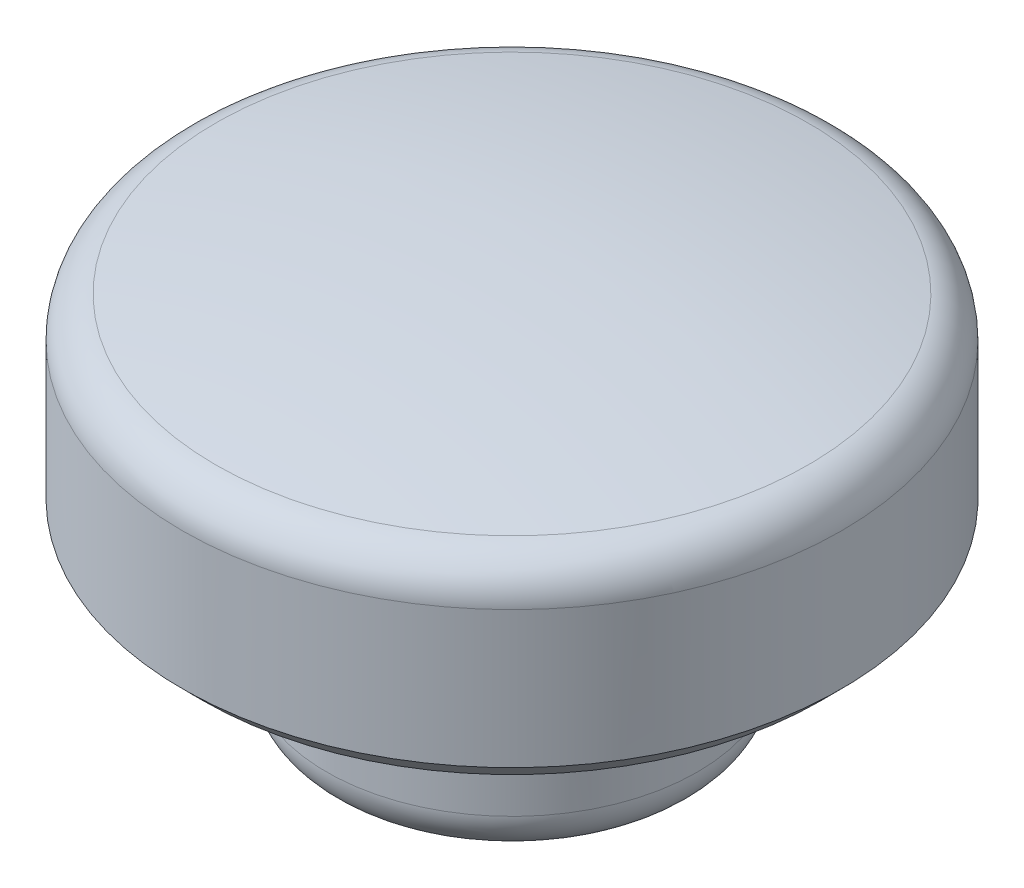
ISO-10303-21;
HEADER;
FILE_DESCRIPTION(('STEP AP214'),'2;1');
FILE_NAME('part.step','',(''),(''),'','','');
FILE_SCHEMA(('AUTOMOTIVE_DESIGN { 1 0 10303 214 1 1 1 1 }'));
ENDSEC;
DATA;
#1=APPLICATION_CONTEXT('core data for automotive mechanical design processes');
#2=APPLICATION_PROTOCOL_DEFINITION('international standard','automotive_design',2000,#1);
#3=PRODUCT_CONTEXT('',#1,'mechanical');
#4=PRODUCT('Part','Part','',(#3));
#5=PRODUCT_RELATED_PRODUCT_CATEGORY('part','',(#4));
#6=PRODUCT_DEFINITION_FORMATION('','',#4);
#7=PRODUCT_DEFINITION_CONTEXT('part definition',#1,'design');
#8=PRODUCT_DEFINITION('design','',#6,#7);
#9=PRODUCT_DEFINITION_SHAPE('','',#8);
#10=(LENGTH_UNIT() NAMED_UNIT(*) SI_UNIT(.MILLI.,.METRE.));
#11=(NAMED_UNIT(*) PLANE_ANGLE_UNIT() SI_UNIT($,.RADIAN.));
#12=(NAMED_UNIT(*) SI_UNIT($,.STERADIAN.) SOLID_ANGLE_UNIT());
#13=UNCERTAINTY_MEASURE_WITH_UNIT(LENGTH_MEASURE(1.E-05),#10,'distance_accuracy_value','');
#14=(GEOMETRIC_REPRESENTATION_CONTEXT(3) GLOBAL_UNCERTAINTY_ASSIGNED_CONTEXT((#13)) GLOBAL_UNIT_ASSIGNED_CONTEXT((#10,
#11,#12)) REPRESENTATION_CONTEXT('',''));
#15=CARTESIAN_POINT('',(0.,0.,0.));
#16=DIRECTION('',(0.,0.,1.));
#17=DIRECTION('',(1.,0.,0.));
#18=AXIS2_PLACEMENT_3D('',#15,#16,#17);
#19=CARTESIAN_POINT('',(0.,7.99999999884449,0.));
#20=DIRECTION('',(0.,-1.,0.));
#21=DIRECTION('',(1.,0.,0.));
#22=AXIS2_PLACEMENT_3D('',#19,#20,#21);
#23=CONICAL_SURFACE('',#22,2.06699999910143,1.02974425731207);
#24=CARTESIAN_POINT('',(-2.27373675443232E-10,9.24197890128653,0.));
#25=VERTEX_POINT('',#24);
#26=VERTEX_LOOP('',#25);
#27=FACE_BOUND('',#26,.T.);
#28=CARTESIAN_POINT('',(0.,8.,0.));
#29=DIRECTION('',(0.,-1.,0.));
#30=DIRECTION('',(1.,0.,0.));
#31=AXIS2_PLACEMENT_3D('',#28,#29,#30);
#32=CIRCLE('',#31,2.067);
#33=CARTESIAN_POINT('',(2.067,8.,0.));
#34=VERTEX_POINT('',#33);
#35=EDGE_CURVE('E33',#34,#34,#32,.T.);
#36=ORIENTED_EDGE('',*,*,#35,.T.);
#37=EDGE_LOOP('',(#36));
#38=FACE_BOUND('',#37,.T.);
#39=ADVANCED_FACE('F17',(#27,#38),#23,.F.);
#40=CARTESIAN_POINT('',(0.,4.,0.));
#41=DIRECTION('',(0.,-1.,0.));
#42=DIRECTION('',(1.,0.,0.));
#43=AXIS2_PLACEMENT_3D('',#40,#41,#42);
#44=CYLINDRICAL_SURFACE('',#43,2.067);
#45=ORIENTED_EDGE('',*,*,#35,.F.);
#46=EDGE_LOOP('',(#45));
#47=FACE_BOUND('',#46,.T.);
#48=CARTESIAN_POINT('',(0.,0.,0.));
#49=DIRECTION('',(0.,-1.,0.));
#50=DIRECTION('',(1.,0.,0.));
#51=AXIS2_PLACEMENT_3D('',#48,#49,#50);
#52=CIRCLE('',#51,2.067);
#53=CARTESIAN_POINT('',(2.067,0.,0.));
#54=VERTEX_POINT('',#53);
#55=EDGE_CURVE('E20',#54,#54,#52,.F.);
#56=ORIENTED_EDGE('',*,*,#55,.F.);
#57=EDGE_LOOP('',(#56));
#58=FACE_BOUND('',#57,.T.);
#59=ADVANCED_FACE('F30',(#47,#58),#44,.F.);
#60=CARTESIAN_POINT('',(-3.5,0.,0.));
#61=DIRECTION('',(0.,-1.,0.));
#62=DIRECTION('',(0.,0.,-1.));
#63=AXIS2_PLACEMENT_3D('',#60,#61,#62);
#64=PLANE('',#63);
#65=ORIENTED_EDGE('',*,*,#55,.T.);
#66=EDGE_LOOP('',(#65));
#67=FACE_BOUND('',#66,.T.);
#68=CARTESIAN_POINT('',(0.,0.,0.));
#69=DIRECTION('',(0.,1.,0.));
#70=DIRECTION('',(-1.,0.,0.));
#71=AXIS2_PLACEMENT_3D('',#68,#69,#70);
#72=CIRCLE('',#71,7.);
#73=CARTESIAN_POINT('',(-7.,0.,0.));
#74=VERTEX_POINT('',#73);
#75=EDGE_CURVE('E37',#74,#74,#72,.T.);
#76=ORIENTED_EDGE('',*,*,#75,.F.);
#77=EDGE_LOOP('',(#76));
#78=FACE_BOUND('',#77,.T.);
#79=ADVANCED_FACE('F81',(#67,#78),#64,.T.);
#80=CARTESIAN_POINT('',(0.,2.,0.));
#81=DIRECTION('',(0.,1.,0.));
#82=DIRECTION('',(0.,0.,1.));
#83=AXIS2_PLACEMENT_3D('',#80,#81,#82);
#84=TOROIDAL_SURFACE('',#83,7.,2.);
#85=ORIENTED_EDGE('',*,*,#75,.T.);
#86=EDGE_LOOP('',(#85));
#87=FACE_BOUND('',#86,.T.);
#88=CARTESIAN_POINT('',(0.,2.,0.));
#89=DIRECTION('',(0.,1.,0.));
#90=DIRECTION('',(-1.,0.,0.));
#91=AXIS2_PLACEMENT_3D('',#88,#89,#90);
#92=CIRCLE('',#91,9.);
#93=CARTESIAN_POINT('',(-9.,2.,0.));
#94=VERTEX_POINT('',#93);
#95=EDGE_CURVE('E57',#94,#94,#92,.T.);
#96=ORIENTED_EDGE('',*,*,#95,.F.);
#97=EDGE_LOOP('',(#96));
#98=FACE_BOUND('',#97,.T.);
#99=ADVANCED_FACE('F75',(#87,#98),#84,.T.);
#100=CARTESIAN_POINT('',(0.,5.,0.));
#101=DIRECTION('',(0.,1.,0.));
#102=DIRECTION('',(-1.,0.,0.));
#103=AXIS2_PLACEMENT_3D('',#100,#101,#102);
#104=CYLINDRICAL_SURFACE('',#103,9.);
#105=ORIENTED_EDGE('',*,*,#95,.T.);
#106=EDGE_LOOP('',(#105));
#107=FACE_BOUND('',#106,.T.);
#108=CARTESIAN_POINT('',(0.,8.,0.));
#109=DIRECTION('',(0.,1.,0.));
#110=DIRECTION('',(0.,0.,1.));
#111=AXIS2_PLACEMENT_3D('',#108,#109,#110);
#112=CIRCLE('',#111,9.);
#113=CARTESIAN_POINT('',(0.,8.,9.));
#114=VERTEX_POINT('',#113);
#115=EDGE_CURVE('E53',#114,#114,#112,.F.);
#116=ORIENTED_EDGE('',*,*,#115,.T.);
#117=EDGE_LOOP('',(#116));
#118=FACE_BOUND('',#117,.T.);
#119=ADVANCED_FACE('F80',(#107,#118),#104,.T.);
#120=CARTESIAN_POINT('',(0.,8.,0.));
#121=DIRECTION('',(0.,1.,0.));
#122=DIRECTION('',(0.,0.,1.));
#123=AXIS2_PLACEMENT_3D('',#120,#121,#122);
#124=TOROIDAL_SURFACE('',#123,10.,1.);
#125=ORIENTED_EDGE('',*,*,#115,.F.);
#126=EDGE_LOOP('',(#125));
#127=FACE_BOUND('',#126,.T.);
#128=CARTESIAN_POINT('',(0.,8.,0.));
#129=DIRECTION('',(0.,1.,0.));
#130=DIRECTION('',(-1.,0.,0.));
#131=AXIS2_PLACEMENT_3D('',#128,#129,#130);
#132=CIRCLE('',#131,11.);
#133=CARTESIAN_POINT('',(-11.,8.,0.));
#134=VERTEX_POINT('',#133);
#135=EDGE_CURVE('E51',#134,#134,#132,.T.);
#136=ORIENTED_EDGE('',*,*,#135,.F.);
#137=EDGE_LOOP('',(#136));
#138=FACE_BOUND('',#137,.T.);
#139=ADVANCED_FACE('F100',(#127,#138),#124,.F.);
#140=CARTESIAN_POINT('',(-13.,8.,0.));
#141=DIRECTION('',(0.,-1.,0.));
#142=DIRECTION('',(0.,0.,-1.));
#143=AXIS2_PLACEMENT_3D('',#140,#141,#142);
#144=PLANE('',#143);
#145=ORIENTED_EDGE('',*,*,#135,.T.);
#146=EDGE_LOOP('',(#145));
#147=FACE_BOUND('',#146,.T.);
#148=CARTESIAN_POINT('',(0.,7.99999999955128,0.));
#149=DIRECTION('',(0.,1.,0.));
#150=DIRECTION('',(-1.,0.,0.));
#151=AXIS2_PLACEMENT_3D('',#148,#149,#150);
#152=CIRCLE('',#151,15.0000000004487);
#153=CARTESIAN_POINT('',(-15.0000000004487,7.99999999955127,0.));
#154=VERTEX_POINT('',#153);
#155=EDGE_CURVE('E49',#154,#154,#152,.T.);
#156=ORIENTED_EDGE('',*,*,#155,.F.);
#157=EDGE_LOOP('',(#156));
#158=FACE_BOUND('',#157,.T.);
#159=ADVANCED_FACE('F105',(#147,#158),#144,.T.);
#160=CARTESIAN_POINT('',(0.,-56.,0.));
#161=DIRECTION('',(1.,0.,0.));
#162=DIRECTION('',(0.,1.,0.));
#163=AXIS2_PLACEMENT_3D('',#160,#161,#162);
#164=SPHERICAL_SURFACE('',#163,75.);
#165=CARTESIAN_POINT('',(0.,17.6078335127314,0.));
#166=DIRECTION('',(0.,1.,0.));
#167=DIRECTION('',(0.,0.,1.));
#168=AXIS2_PLACEMENT_3D('',#165,#166,#167);
#169=CIRCLE('',#168,14.3835616438356);
#170=CARTESIAN_POINT('',(0.,17.6078335127314,14.3835616438356));
#171=VERTEX_POINT('',#170);
#172=EDGE_CURVE('E46',#171,#171,#169,.F.);
#173=ORIENTED_EDGE('',*,*,#172,.F.);
#174=EDGE_LOOP('',(#173));
#175=FACE_BOUND('',#174,.T.);
#176=ADVANCED_FACE('F127',(#175),#164,.T.);
#177=CARTESIAN_POINT('',(0.,9.00000000044873,0.));
#178=DIRECTION('',(0.,1.,0.));
#179=DIRECTION('',(-1.,0.,0.));
#180=AXIS2_PLACEMENT_3D('',#177,#178,#179);
#181=CONICAL_SURFACE('',#180,15.9999999995513,0.7853981625);
#182=ORIENTED_EDGE('',*,*,#155,.T.);
#183=EDGE_LOOP('',(#182));
#184=FACE_BOUND('',#183,.T.);
#185=CARTESIAN_POINT('',(0.,9.00000000000001,0.));
#186=DIRECTION('',(0.,1.,0.));
#187=DIRECTION('',(-1.,0.,0.));
#188=AXIS2_PLACEMENT_3D('',#185,#186,#187);
#189=CIRCLE('',#188,16.);
#190=CARTESIAN_POINT('',(-16.,9.,0.));
#191=VERTEX_POINT('',#190);
#192=EDGE_CURVE('E24',#191,#191,#189,.T.);
#193=ORIENTED_EDGE('',*,*,#192,.F.);
#194=EDGE_LOOP('',(#193));
#195=FACE_BOUND('',#194,.T.);
#196=ADVANCED_FACE('F115',(#184,#195),#181,.T.);
#197=CARTESIAN_POINT('',(0.,15.6449579523919,0.));
#198=DIRECTION('',(0.,1.,0.));
#199=DIRECTION('',(0.,0.,1.));
#200=AXIS2_PLACEMENT_3D('',#197,#198,#199);
#201=TOROIDAL_SURFACE('',#200,14.,2.);
#202=ORIENTED_EDGE('',*,*,#172,.T.);
#203=EDGE_LOOP('',(#202));
#204=FACE_BOUND('',#203,.T.);
#205=CARTESIAN_POINT('',(0.,15.6449579523919,0.));
#206=DIRECTION('',(0.,1.,0.));
#207=DIRECTION('',(-1.,0.,0.));
#208=AXIS2_PLACEMENT_3D('',#205,#206,#207);
#209=CIRCLE('',#208,16.);
#210=CARTESIAN_POINT('',(-16.,15.6449579523919,0.));
#211=VERTEX_POINT('',#210);
#212=EDGE_CURVE('E11',#211,#211,#209,.F.);
#213=ORIENTED_EDGE('',*,*,#212,.F.);
#214=EDGE_LOOP('',(#213));
#215=FACE_BOUND('',#214,.T.);
#216=ADVANCED_FACE('F109',(#204,#215),#201,.T.);
#217=CARTESIAN_POINT('',(0.,13.1367302034447,0.));
#218=DIRECTION('',(0.,1.,0.));
#219=DIRECTION('',(-1.,0.,0.));
#220=AXIS2_PLACEMENT_3D('',#217,#218,#219);
#221=CYLINDRICAL_SURFACE('',#220,16.);
#222=ORIENTED_EDGE('',*,*,#212,.T.);
#223=EDGE_LOOP('',(#222));
#224=FACE_BOUND('',#223,.T.);
#225=ORIENTED_EDGE('',*,*,#192,.T.);
#226=EDGE_LOOP('',(#225));
#227=FACE_BOUND('',#226,.T.);
#228=ADVANCED_FACE('F107',(#224,#227),#221,.T.);
#229=CLOSED_SHELL('',(#39,#59,#79,#99,#119,#139,#159,#176,#196,#216,#228));
#230=MANIFOLD_SOLID_BREP('B1',#229);
#231=ADVANCED_BREP_SHAPE_REPRESENTATION('',(#18,#230),#14);
#232=SHAPE_DEFINITION_REPRESENTATION(#9,#231);
ENDSEC;
END-ISO-10303-21;
